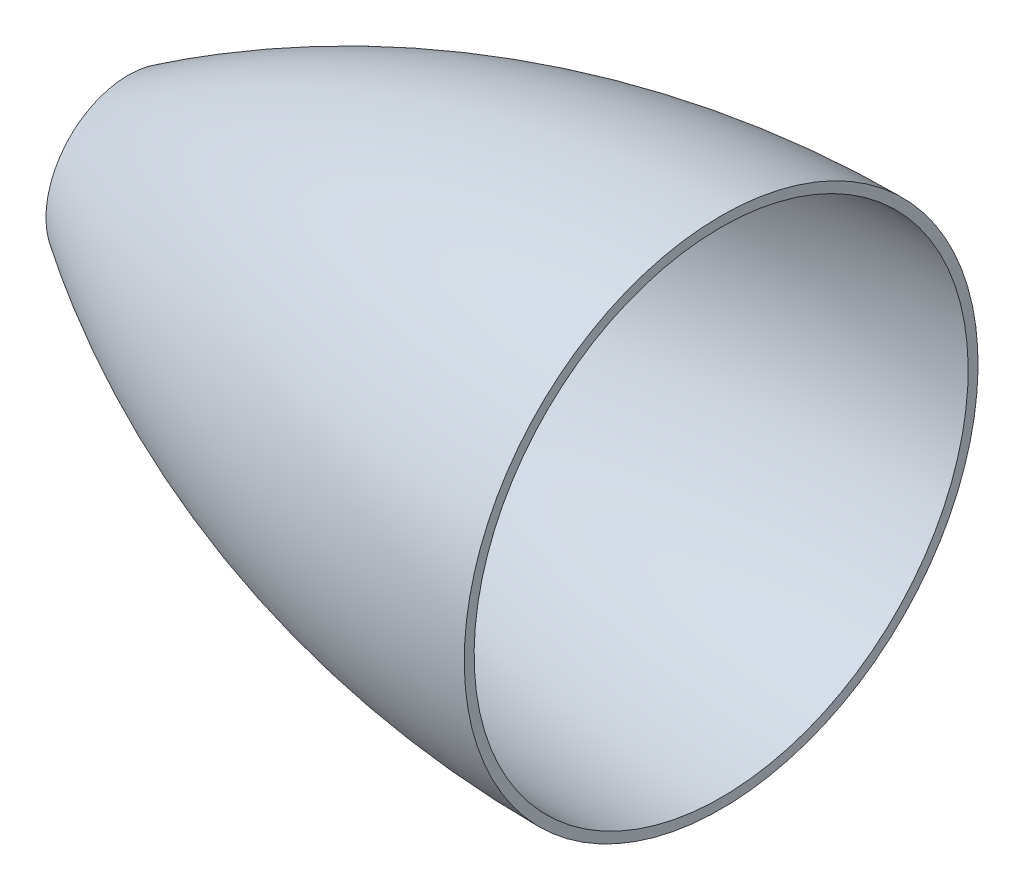
ISO-10303-21;
HEADER;
FILE_DESCRIPTION(('STEP AP214'),'2;1');
FILE_NAME('part.step','',(''),(''),'','','');
FILE_SCHEMA(('AUTOMOTIVE_DESIGN { 1 0 10303 214 1 1 1 1 }'));
ENDSEC;
DATA;
#1=APPLICATION_CONTEXT('core data for automotive mechanical design processes');
#2=APPLICATION_PROTOCOL_DEFINITION('international standard','automotive_design',2000,#1);
#3=PRODUCT_CONTEXT('',#1,'mechanical');
#4=PRODUCT('Part','Part','',(#3));
#5=PRODUCT_RELATED_PRODUCT_CATEGORY('part','',(#4));
#6=PRODUCT_DEFINITION_FORMATION('','',#4);
#7=PRODUCT_DEFINITION_CONTEXT('part definition',#1,'design');
#8=PRODUCT_DEFINITION('design','',#6,#7);
#9=PRODUCT_DEFINITION_SHAPE('','',#8);
#10=(LENGTH_UNIT() NAMED_UNIT(*) SI_UNIT(.MILLI.,.METRE.));
#11=(NAMED_UNIT(*) PLANE_ANGLE_UNIT() SI_UNIT($,.RADIAN.));
#12=(NAMED_UNIT(*) SI_UNIT($,.STERADIAN.) SOLID_ANGLE_UNIT());
#13=UNCERTAINTY_MEASURE_WITH_UNIT(LENGTH_MEASURE(1.E-05),#10,'distance_accuracy_value','');
#14=(GEOMETRIC_REPRESENTATION_CONTEXT(3) GLOBAL_UNCERTAINTY_ASSIGNED_CONTEXT((#13)) GLOBAL_UNIT_ASSIGNED_CONTEXT((#10,
#11,#12)) REPRESENTATION_CONTEXT('',''));
#15=CARTESIAN_POINT('',(0.,0.,0.));
#16=DIRECTION('',(0.,0.,1.));
#17=DIRECTION('',(1.,0.,0.));
#18=AXIS2_PLACEMENT_3D('',#15,#16,#17);
#19=CARTESIAN_POINT('',(-992.682976554997,27.9999999999999,0.));
#20=DIRECTION('',(1.,0.,0.));
#21=DIRECTION('',(0.,1.,0.));
#22=AXIS2_PLACEMENT_3D('',#19,#20,#21);
#23=PLANE('',#22);
#24=CARTESIAN_POINT('',(-992.682976554997,0.,0.));
#25=DIRECTION('',(1.,0.,0.));
#26=DIRECTION('',(0.,1.,0.));
#27=AXIS2_PLACEMENT_3D('',#24,#25,#26);
#28=CIRCLE('',#27,27.9999999999999);
#29=CARTESIAN_POINT('',(-992.682976554997,27.9999999999999,0.));
#30=VERTEX_POINT('',#29);
#31=EDGE_CURVE('E10',#30,#30,#28,.T.);
#32=ORIENTED_EDGE('',*,*,#31,.T.);
#33=EDGE_LOOP('',(#32));
#34=FACE_BOUND('',#33,.T.);
#35=ADVANCED_FACE('F29',(#34),#23,.T.);
#36=CARTESIAN_POINT('',(-860.682976554997,0.,0.));
#37=DIRECTION('',(1.,0.,0.));
#38=DIRECTION('',(0.,1.,0.));
#39=AXIS2_PLACEMENT_3D('',#36,#37,#38);
#40=CYLINDRICAL_SURFACE('',#39,27.9999999999999);
#41=CARTESIAN_POINT('',(-1030.18836134173,0.,0.));
#42=DIRECTION('',(1.,0.,0.));
#43=DIRECTION('',(0.,1.,0.));
#44=AXIS2_PLACEMENT_3D('',#41,#42,#43);
#45=CIRCLE('',#44,27.9999999999999);
#46=CARTESIAN_POINT('',(-1030.18836134173,27.9999999999999,0.));
#47=VERTEX_POINT('',#46);
#48=EDGE_CURVE('E35',#47,#47,#45,.T.);
#49=ORIENTED_EDGE('',*,*,#48,.T.);
#50=EDGE_LOOP('',(#49));
#51=FACE_BOUND('',#50,.T.);
#52=ORIENTED_EDGE('',*,*,#31,.F.);
#53=EDGE_LOOP('',(#52));
#54=FACE_BOUND('',#53,.T.);
#55=ADVANCED_FACE('F67',(#51,#54),#40,.T.);
#56=CARTESIAN_POINT('',(-860.682976554996,0.,0.));
#57=DIRECTION('',(1.,0.,0.));
#58=DIRECTION('',(0.,1.,0.));
#59=AXIS2_PLACEMENT_3D('',#56,#57,#58);
#60=DEGENERATE_TOROIDAL_SURFACE('',#59,254.160377358496,329.160377358495,.F.);
#61=CARTESIAN_POINT('',(-860.682976554996,0.,0.));
#62=DIRECTION('',(1.,0.,0.));
#63=DIRECTION('',(0.,1.,0.));
#64=AXIS2_PLACEMENT_3D('',#61,#62,#63);
#65=CIRCLE('',#64,74.999999999999);
#66=CARTESIAN_POINT('',(-860.682976554996,74.9999999999991,0.));
#67=VERTEX_POINT('',#66);
#68=EDGE_CURVE('E39',#67,#67,#65,.T.);
#69=ORIENTED_EDGE('',*,*,#68,.T.);
#70=EDGE_LOOP('',(#69));
#71=FACE_BOUND('',#70,.T.);
#72=ORIENTED_EDGE('',*,*,#48,.F.);
#73=EDGE_LOOP('',(#72));
#74=FACE_BOUND('',#73,.T.);
#75=ADVANCED_FACE('F71',(#71,#74),#60,.T.);
#76=CARTESIAN_POINT('',(-860.682976554996,77.9999999999991,0.));
#77=DIRECTION('',(1.,0.,0.));
#78=DIRECTION('',(0.,1.,0.));
#79=AXIS2_PLACEMENT_3D('',#76,#77,#78);
#80=PLANE('',#79);
#81=CARTESIAN_POINT('',(-860.682976554996,0.,0.));
#82=DIRECTION('',(1.,0.,0.));
#83=DIRECTION('',(0.,1.,0.));
#84=AXIS2_PLACEMENT_3D('',#81,#82,#83);
#85=CIRCLE('',#84,77.999999999999);
#86=CARTESIAN_POINT('',(-860.682976554996,77.9999999999991,0.));
#87=VERTEX_POINT('',#86);
#88=EDGE_CURVE('E43',#87,#87,#85,.T.);
#89=ORIENTED_EDGE('',*,*,#88,.T.);
#90=EDGE_LOOP('',(#89));
#91=FACE_BOUND('',#90,.T.);
#92=ORIENTED_EDGE('',*,*,#68,.F.);
#93=EDGE_LOOP('',(#92));
#94=FACE_BOUND('',#93,.T.);
#95=ADVANCED_FACE('F75',(#91,#94),#80,.T.);
#96=CARTESIAN_POINT('',(-860.682976554996,0.,0.));
#97=DIRECTION('',(1.,0.,0.));
#98=DIRECTION('',(0.,1.,0.));
#99=AXIS2_PLACEMENT_3D('',#96,#97,#98);
#100=DEGENERATE_TOROIDAL_SURFACE('',#99,254.160377358496,332.160377358495,.F.);
#101=CARTESIAN_POINT('',(-1040.682976555,0.,0.));
#102=DIRECTION('',(1.,0.,0.));
#103=DIRECTION('',(0.,1.,0.));
#104=AXIS2_PLACEMENT_3D('',#101,#102,#103);
#105=CIRCLE('',#104,25.);
#106=CARTESIAN_POINT('',(-1040.682976555,25.,0.));
#107=VERTEX_POINT('',#106);
#108=EDGE_CURVE('E48',#107,#107,#105,.T.);
#109=ORIENTED_EDGE('',*,*,#108,.T.);
#110=EDGE_LOOP('',(#109));
#111=FACE_BOUND('',#110,.T.);
#112=ORIENTED_EDGE('',*,*,#88,.F.);
#113=EDGE_LOOP('',(#112));
#114=FACE_BOUND('',#113,.T.);
#115=ADVANCED_FACE('F64',(#111,#114),#100,.F.);
#116=CARTESIAN_POINT('',(-860.682976554997,0.,0.));
#117=DIRECTION('',(1.,0.,0.));
#118=DIRECTION('',(0.,1.,0.));
#119=AXIS2_PLACEMENT_3D('',#116,#117,#118);
#120=CYLINDRICAL_SURFACE('',#119,25.);
#121=CARTESIAN_POINT('',(-995.682976554997,0.,0.));
#122=DIRECTION('',(1.,0.,0.));
#123=DIRECTION('',(0.,1.,0.));
#124=AXIS2_PLACEMENT_3D('',#121,#122,#123);
#125=CIRCLE('',#124,25.);
#126=CARTESIAN_POINT('',(-995.682976554997,25.,0.));
#127=VERTEX_POINT('',#126);
#128=EDGE_CURVE('E51',#127,#127,#125,.T.);
#129=ORIENTED_EDGE('',*,*,#128,.T.);
#130=EDGE_LOOP('',(#129));
#131=FACE_BOUND('',#130,.T.);
#132=ORIENTED_EDGE('',*,*,#108,.F.);
#133=EDGE_LOOP('',(#132));
#134=FACE_BOUND('',#133,.T.);
#135=ADVANCED_FACE('F55',(#131,#134),#120,.F.);
#136=CARTESIAN_POINT('',(-995.682976554997,0.,0.));
#137=DIRECTION('',(-1.,0.,0.));
#138=DIRECTION('',(0.,-1.,0.));
#139=AXIS2_PLACEMENT_3D('',#136,#137,#138);
#140=PLANE('',#139);
#141=ORIENTED_EDGE('',*,*,#128,.F.);
#142=EDGE_LOOP('',(#141));
#143=FACE_BOUND('',#142,.T.);
#144=ADVANCED_FACE('F58',(#143),#140,.T.);
#145=CLOSED_SHELL('',(#35,#55,#75,#95,#115,#135,#144));
#146=MANIFOLD_SOLID_BREP('B2',#145);
#147=ADVANCED_BREP_SHAPE_REPRESENTATION('',(#18,#146),#14);
#148=SHAPE_DEFINITION_REPRESENTATION(#9,#147);
ENDSEC;
END-ISO-10303-21;
